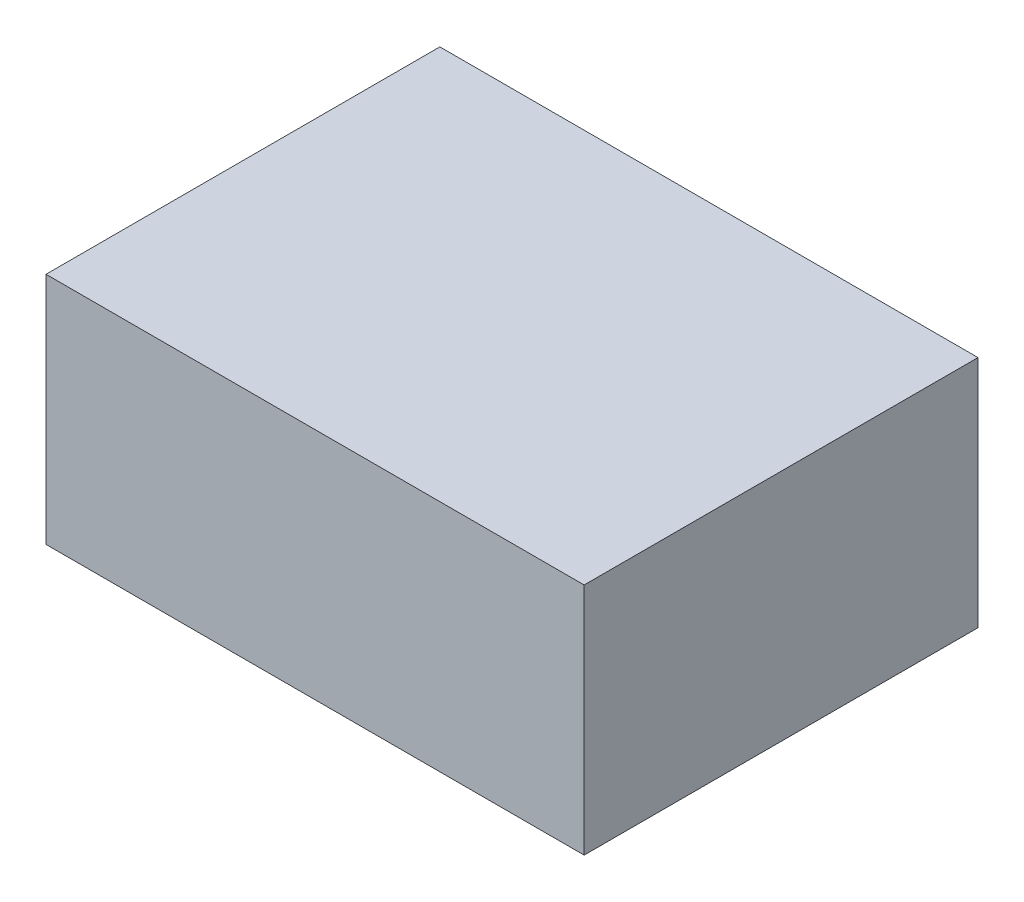
ISO-10303-21;
HEADER;
FILE_DESCRIPTION(('STEP AP214'),'2;1');
FILE_NAME('part.step','',(''),(''),'','','');
FILE_SCHEMA(('AUTOMOTIVE_DESIGN { 1 0 10303 214 1 1 1 1 }'));
ENDSEC;
DATA;
#1=APPLICATION_CONTEXT('core data for automotive mechanical design processes');
#2=APPLICATION_PROTOCOL_DEFINITION('international standard','automotive_design',2000,#1);
#3=PRODUCT_CONTEXT('',#1,'mechanical');
#4=PRODUCT('Part','Part','',(#3));
#5=PRODUCT_RELATED_PRODUCT_CATEGORY('part','',(#4));
#6=PRODUCT_DEFINITION_FORMATION('','',#4);
#7=PRODUCT_DEFINITION_CONTEXT('part definition',#1,'design');
#8=PRODUCT_DEFINITION('design','',#6,#7);
#9=PRODUCT_DEFINITION_SHAPE('','',#8);
#10=(LENGTH_UNIT() NAMED_UNIT(*) SI_UNIT(.MILLI.,.METRE.));
#11=(NAMED_UNIT(*) PLANE_ANGLE_UNIT() SI_UNIT($,.RADIAN.));
#12=(NAMED_UNIT(*) SI_UNIT($,.STERADIAN.) SOLID_ANGLE_UNIT());
#13=UNCERTAINTY_MEASURE_WITH_UNIT(LENGTH_MEASURE(1.E-05),#10,'distance_accuracy_value','');
#14=(GEOMETRIC_REPRESENTATION_CONTEXT(3) GLOBAL_UNCERTAINTY_ASSIGNED_CONTEXT((#13)) GLOBAL_UNIT_ASSIGNED_CONTEXT((#10,
#11,#12)) REPRESENTATION_CONTEXT('',''));
#15=CARTESIAN_POINT('',(0.,0.,0.));
#16=DIRECTION('',(0.,0.,1.));
#17=DIRECTION('',(1.,0.,0.));
#18=AXIS2_PLACEMENT_3D('',#15,#16,#17);
#19=CARTESIAN_POINT('',(3.45,3.,2.525));
#20=DIRECTION('',(-1.,0.,0.));
#21=DIRECTION('',(0.,0.,1.));
#22=AXIS2_PLACEMENT_3D('',#19,#20,#21);
#23=PLANE('',#22);
#24=DIRECTION('',(0.,0.,-1.));
#25=VECTOR('',#24,1.);
#26=CARTESIAN_POINT('',(3.45,0.,2.525));
#27=LINE('',#26,#25);
#28=CARTESIAN_POINT('',(3.45,0.,2.525));
#29=VERTEX_POINT('',#28);
#30=CARTESIAN_POINT('',(3.45,0.,-2.525));
#31=VERTEX_POINT('',#30);
#32=EDGE_CURVE('E98',#29,#31,#27,.T.);
#33=ORIENTED_EDGE('',*,*,#32,.T.);
#34=DIRECTION('',(0.,-1.,0.));
#35=VECTOR('',#34,1.);
#36=CARTESIAN_POINT('',(3.45,3.,-2.525));
#37=LINE('',#36,#35);
#38=CARTESIAN_POINT('',(3.45,3.,-2.525));
#39=VERTEX_POINT('',#38);
#40=EDGE_CURVE('E11',#39,#31,#37,.T.);
#41=ORIENTED_EDGE('',*,*,#40,.F.);
#42=DIRECTION('',(0.,0.,-1.));
#43=VECTOR('',#42,1.);
#44=CARTESIAN_POINT('',(3.45,3.,2.525));
#45=LINE('',#44,#43);
#46=CARTESIAN_POINT('',(3.45,3.,2.525));
#47=VERTEX_POINT('',#46);
#48=EDGE_CURVE('E86',#47,#39,#45,.T.);
#49=ORIENTED_EDGE('',*,*,#48,.F.);
#50=DIRECTION('',(0.,-1.,0.));
#51=VECTOR('',#50,1.);
#52=CARTESIAN_POINT('',(3.45,3.,2.525));
#53=LINE('',#52,#51);
#54=EDGE_CURVE('E94',#47,#29,#53,.T.);
#55=ORIENTED_EDGE('',*,*,#54,.T.);
#56=EDGE_LOOP('',(#33,#41,#49,#55));
#57=FACE_BOUND('',#56,.T.);
#58=ADVANCED_FACE('F35',(#57),#23,.F.);
#59=CARTESIAN_POINT('',(-3.45,3.,-2.525));
#60=DIRECTION('',(0.,0.,1.));
#61=DIRECTION('',(1.,0.,0.));
#62=AXIS2_PLACEMENT_3D('',#59,#60,#61);
#63=PLANE('',#62);
#64=DIRECTION('',(-1.,0.,0.));
#65=VECTOR('',#64,1.);
#66=CARTESIAN_POINT('',(-3.45,0.,-2.525));
#67=LINE('',#66,#65);
#68=CARTESIAN_POINT('',(-3.45,0.,-2.525));
#69=VERTEX_POINT('',#68);
#70=EDGE_CURVE('E90',#31,#69,#67,.T.);
#71=ORIENTED_EDGE('',*,*,#70,.T.);
#72=DIRECTION('',(0.,-1.,0.));
#73=VECTOR('',#72,1.);
#74=CARTESIAN_POINT('',(-3.45,3.,-2.525));
#75=LINE('',#74,#73);
#76=CARTESIAN_POINT('',(-3.45,3.,-2.525));
#77=VERTEX_POINT('',#76);
#78=EDGE_CURVE('E43',#77,#69,#75,.T.);
#79=ORIENTED_EDGE('',*,*,#78,.F.);
#80=DIRECTION('',(-1.,0.,0.));
#81=VECTOR('',#80,1.);
#82=CARTESIAN_POINT('',(-3.45,3.,-2.525));
#83=LINE('',#82,#81);
#84=EDGE_CURVE('E81',#39,#77,#83,.T.);
#85=ORIENTED_EDGE('',*,*,#84,.F.);
#86=ORIENTED_EDGE('',*,*,#40,.T.);
#87=EDGE_LOOP('',(#71,#79,#85,#86));
#88=FACE_BOUND('',#87,.T.);
#89=ADVANCED_FACE('F89',(#88),#63,.F.);
#90=CARTESIAN_POINT('',(-3.45,3.,2.525));
#91=DIRECTION('',(1.,0.,0.));
#92=DIRECTION('',(0.,0.,-1.));
#93=AXIS2_PLACEMENT_3D('',#90,#91,#92);
#94=PLANE('',#93);
#95=DIRECTION('',(0.,0.,1.));
#96=VECTOR('',#95,1.);
#97=CARTESIAN_POINT('',(-3.45,0.,2.525));
#98=LINE('',#97,#96);
#99=CARTESIAN_POINT('',(-3.45,0.,2.525));
#100=VERTEX_POINT('',#99);
#101=EDGE_CURVE('E68',#69,#100,#98,.T.);
#102=ORIENTED_EDGE('',*,*,#101,.T.);
#103=DIRECTION('',(0.,-1.,0.));
#104=VECTOR('',#103,1.);
#105=CARTESIAN_POINT('',(-3.45,3.,2.525));
#106=LINE('',#105,#104);
#107=CARTESIAN_POINT('',(-3.45,3.,2.525));
#108=VERTEX_POINT('',#107);
#109=EDGE_CURVE('E91',#108,#100,#106,.T.);
#110=ORIENTED_EDGE('',*,*,#109,.F.);
#111=DIRECTION('',(0.,0.,1.));
#112=VECTOR('',#111,1.);
#113=CARTESIAN_POINT('',(-3.45,3.,2.525));
#114=LINE('',#113,#112);
#115=EDGE_CURVE('E84',#77,#108,#114,.T.);
#116=ORIENTED_EDGE('',*,*,#115,.F.);
#117=ORIENTED_EDGE('',*,*,#78,.T.);
#118=EDGE_LOOP('',(#102,#110,#116,#117));
#119=FACE_BOUND('',#118,.T.);
#120=ADVANCED_FACE('F92',(#119),#94,.F.);
#121=CARTESIAN_POINT('',(-3.45,3.,2.525));
#122=DIRECTION('',(0.,0.,-1.));
#123=DIRECTION('',(-1.,0.,0.));
#124=AXIS2_PLACEMENT_3D('',#121,#122,#123);
#125=PLANE('',#124);
#126=DIRECTION('',(1.,0.,0.));
#127=VECTOR('',#126,1.);
#128=CARTESIAN_POINT('',(-3.45,0.,2.525));
#129=LINE('',#128,#127);
#130=EDGE_CURVE('E74',#100,#29,#129,.T.);
#131=ORIENTED_EDGE('',*,*,#130,.T.);
#132=ORIENTED_EDGE('',*,*,#54,.F.);
#133=DIRECTION('',(1.,0.,0.));
#134=VECTOR('',#133,1.);
#135=CARTESIAN_POINT('',(-3.45,3.,2.525));
#136=LINE('',#135,#134);
#137=EDGE_CURVE('E51',#108,#47,#136,.T.);
#138=ORIENTED_EDGE('',*,*,#137,.F.);
#139=ORIENTED_EDGE('',*,*,#109,.T.);
#140=EDGE_LOOP('',(#131,#132,#138,#139));
#141=FACE_BOUND('',#140,.T.);
#142=ADVANCED_FACE('F105',(#141),#125,.F.);
#143=CARTESIAN_POINT('',(0.,3.,0.));
#144=DIRECTION('',(0.,-1.,0.));
#145=DIRECTION('',(0.,0.,-1.));
#146=AXIS2_PLACEMENT_3D('',#143,#144,#145);
#147=PLANE('',#146);
#148=ORIENTED_EDGE('',*,*,#48,.T.);
#149=ORIENTED_EDGE('',*,*,#84,.T.);
#150=ORIENTED_EDGE('',*,*,#115,.T.);
#151=ORIENTED_EDGE('',*,*,#137,.T.);
#152=EDGE_LOOP('',(#148,#149,#150,#151));
#153=FACE_BOUND('',#152,.T.);
#154=ADVANCED_FACE('F82',(#153),#147,.F.);
#155=CARTESIAN_POINT('',(0.,0.,0.));
#156=DIRECTION('',(0.,-1.,0.));
#157=DIRECTION('',(0.,0.,-1.));
#158=AXIS2_PLACEMENT_3D('',#155,#156,#157);
#159=PLANE('',#158);
#160=ORIENTED_EDGE('',*,*,#32,.F.);
#161=ORIENTED_EDGE('',*,*,#130,.F.);
#162=ORIENTED_EDGE('',*,*,#101,.F.);
#163=ORIENTED_EDGE('',*,*,#70,.F.);
#164=EDGE_LOOP('',(#160,#161,#162,#163));
#165=FACE_BOUND('',#164,.T.);
#166=ADVANCED_FACE('F108',(#165),#159,.T.);
#167=CLOSED_SHELL('',(#58,#89,#120,#142,#154,#166));
#168=MANIFOLD_SOLID_BREP('B2',#167);
#169=ADVANCED_BREP_SHAPE_REPRESENTATION('',(#18,#168),#14);
#170=SHAPE_DEFINITION_REPRESENTATION(#9,#169);
ENDSEC;
END-ISO-10303-21;
